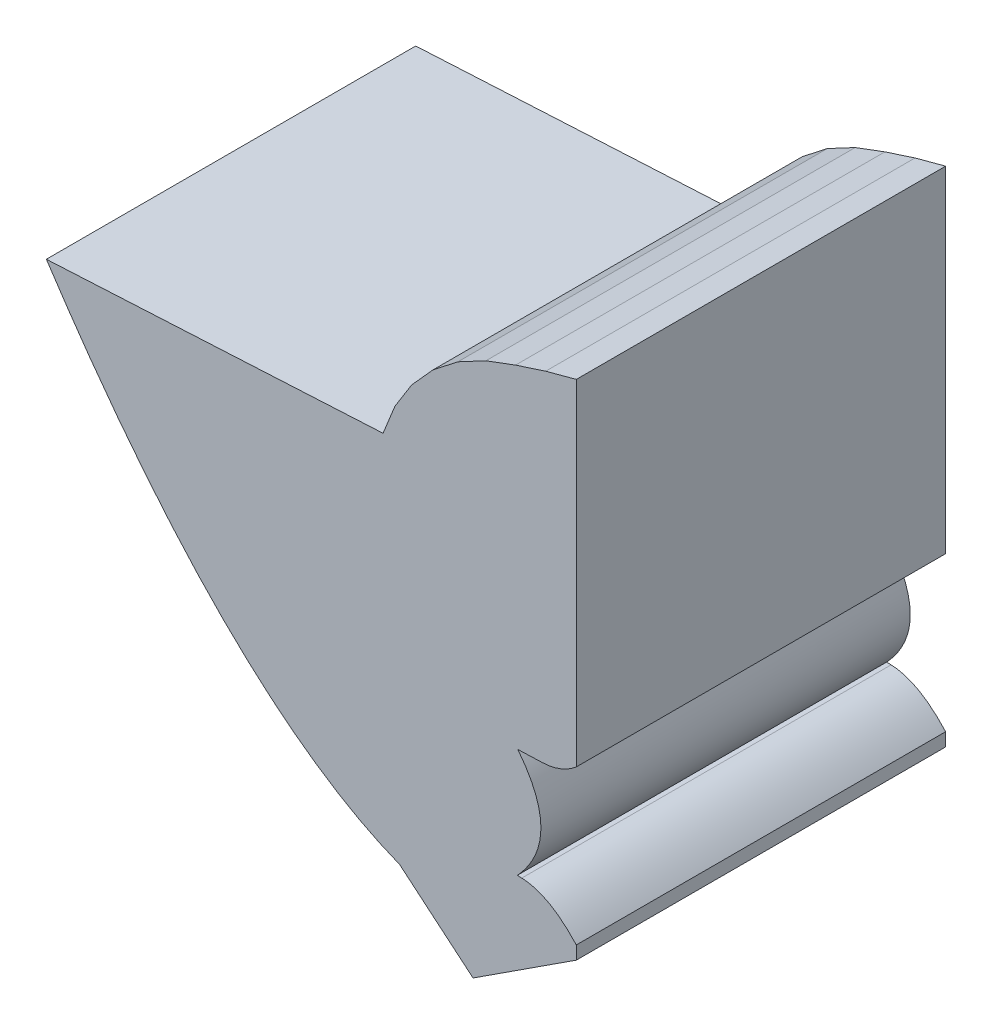
ISO-10303-21;
HEADER;
FILE_DESCRIPTION(('STEP AP214'),'2;1');
FILE_NAME('part.step','',(''),(''),'','','');
FILE_SCHEMA(('AUTOMOTIVE_DESIGN { 1 0 10303 214 1 1 1 1 }'));
ENDSEC;
DATA;
#1=APPLICATION_CONTEXT('core data for automotive mechanical design processes');
#2=APPLICATION_PROTOCOL_DEFINITION('international standard','automotive_design',2000,#1);
#3=PRODUCT_CONTEXT('',#1,'mechanical');
#4=PRODUCT('Part','Part','',(#3));
#5=PRODUCT_RELATED_PRODUCT_CATEGORY('part','',(#4));
#6=PRODUCT_DEFINITION_FORMATION('','',#4);
#7=PRODUCT_DEFINITION_CONTEXT('part definition',#1,'design');
#8=PRODUCT_DEFINITION('design','',#6,#7);
#9=PRODUCT_DEFINITION_SHAPE('','',#8);
#10=(LENGTH_UNIT() NAMED_UNIT(*) SI_UNIT(.MILLI.,.METRE.));
#11=(NAMED_UNIT(*) PLANE_ANGLE_UNIT() SI_UNIT($,.RADIAN.));
#12=(NAMED_UNIT(*) SI_UNIT($,.STERADIAN.) SOLID_ANGLE_UNIT());
#13=UNCERTAINTY_MEASURE_WITH_UNIT(LENGTH_MEASURE(1.E-05),#10,'distance_accuracy_value','');
#14=(GEOMETRIC_REPRESENTATION_CONTEXT(3) GLOBAL_UNCERTAINTY_ASSIGNED_CONTEXT((#13)) GLOBAL_UNIT_ASSIGNED_CONTEXT((#10,
#11,#12)) REPRESENTATION_CONTEXT('',''));
#15=CARTESIAN_POINT('',(0.,0.,0.));
#16=DIRECTION('',(0.,0.,1.));
#17=DIRECTION('',(1.,0.,0.));
#18=AXIS2_PLACEMENT_3D('',#15,#16,#17);
#19=CARTESIAN_POINT('',(-996004.99942647,89338.2959789018,30.7968303069805));
#20=CARTESIAN_POINT('',(996193.448091746,-87155.7427476542,30.7968303069805));
#21=CARTESIAN_POINT('',(-996386.896757022,84973.1895164066,30.7968303069805));
#22=B_SPLINE_CURVE_WITH_KNOTS('',2,(#19,#20,#21),.UNSPECIFIED.,.F.,.F.,(3,3),(0.,1.),.UNSPECIFIED.);
#23=DIRECTION('',(0.,0.,-1.));
#24=VECTOR('',#23,1.);
#25=SURFACE_OF_LINEAR_EXTRUSION('',#22,#24);
#26=CARTESIAN_POINT('',(-996004.99942647,89338.2959789018,6.9937));
#27=CARTESIAN_POINT('',(996193.448091746,-87155.7427476542,6.9937));
#28=CARTESIAN_POINT('',(-996386.896757022,84973.1895164066,6.9937));
#29=B_SPLINE_CURVE_WITH_KNOTS('',2,(#26,#27,#28),.UNSPECIFIED.,.F.,.F.,(3,3),(0.,1.),.UNSPECIFIED.);
#30=CARTESIAN_POINT('',(-2.11351559756429,2.34471545593529,6.9937));
#31=VERTEX_POINT('',#30);
#32=CARTESIAN_POINT('',(-2.13464626381644,-1.79499323034725,6.9937));
#33=VERTEX_POINT('',#32);
#34=EDGE_CURVE('E300',#31,#33,#29,.T.);
#35=ORIENTED_EDGE('',*,*,#34,.T.);
#36=DIRECTION('',(0.,0.,-1.));
#37=VECTOR('',#36,1.);
#38=CARTESIAN_POINT('',(-2.13464626331628,-1.7949932303637,0.));
#39=LINE('',#38,#37);
#40=CARTESIAN_POINT('',(-2.13464626381588,-1.79499323034727,-6.9937));
#41=VERTEX_POINT('',#40);
#42=EDGE_CURVE('E223',#33,#41,#39,.T.);
#43=ORIENTED_EDGE('',*,*,#42,.T.);
#44=CARTESIAN_POINT('',(-996004.99942647,89338.2959789018,-6.9937));
#45=CARTESIAN_POINT('',(996193.448091746,-87155.7427476542,-6.9937));
#46=CARTESIAN_POINT('',(-996386.896757022,84973.1895164066,-6.9937));
#47=B_SPLINE_CURVE_WITH_KNOTS('',2,(#44,#45,#46),.UNSPECIFIED.,.F.,.F.,(3,3),(0.,1.),.UNSPECIFIED.);
#48=CARTESIAN_POINT('',(-2.11351559802885,2.3447154697661,-6.9937));
#49=VERTEX_POINT('',#48);
#50=EDGE_CURVE('E194',#41,#49,#47,.F.);
#51=ORIENTED_EDGE('',*,*,#50,.T.);
#52=DIRECTION('',(0.,0.,-1.));
#53=VECTOR('',#52,1.);
#54=CARTESIAN_POINT('',(-2.11351560820955,2.34471546941639,0.));
#55=LINE('',#54,#53);
#56=EDGE_CURVE('E64',#49,#31,#55,.F.);
#57=ORIENTED_EDGE('',*,*,#56,.T.);
#58=EDGE_LOOP('',(#35,#43,#51,#57));
#59=FACE_BOUND('',#58,.T.);
#60=ADVANCED_FACE('F60',(#59),#25,.T.);
#61=CARTESIAN_POINT('',(-82931.2998220372,996560.090302793,30.7968303069805));
#62=CARTESIAN_POINT('',(87153.689514863,-996199.076380996,30.7968303069805));
#63=CARTESIAN_POINT('',(-91384.2921388703,995820.549302198,30.7968303069805));
#64=B_SPLINE_CURVE_WITH_KNOTS('',2,(#61,#62,#63),.UNSPECIFIED.,.F.,.F.,(3,3),(0.,1.),.UNSPECIFIED.);
#65=DIRECTION('',(0.,0.,-1.));
#66=VECTOR('',#65,1.);
#67=SURFACE_OF_LINEAR_EXTRUSION('',#64,#66);
#68=CARTESIAN_POINT('',(-82931.2998220372,996560.090302793,-6.9937));
#69=CARTESIAN_POINT('',(87153.689514863,-996199.076380996,-6.9937));
#70=CARTESIAN_POINT('',(-91384.2921388703,995820.549302198,-6.9937));
#71=B_SPLINE_CURVE_WITH_KNOTS('',2,(#68,#69,#70),.UNSPECIFIED.,.F.,.F.,(3,3),(0.,1.),.UNSPECIFIED.);
#72=CARTESIAN_POINT('',(-19.9693590135837,9.49376503209609,-6.9937));
#73=VERTEX_POINT('',#72);
#74=CARTESIAN_POINT('',(-6.59172557270748,-3.66645273975933,-6.9937));
#75=VERTEX_POINT('',#74);
#76=EDGE_CURVE('E286',#73,#75,#71,.F.);
#77=ORIENTED_EDGE('',*,*,#76,.T.);
#78=DIRECTION('',(0.,0.,-1.));
#79=VECTOR('',#78,1.);
#80=CARTESIAN_POINT('',(-6.5917255666248,-3.66645274484872,0.));
#81=LINE('',#80,#79);
#82=CARTESIAN_POINT('',(-6.59172557443743,-3.66645274183619,6.9937));
#83=VERTEX_POINT('',#82);
#84=EDGE_CURVE('E13',#75,#83,#81,.F.);
#85=ORIENTED_EDGE('',*,*,#84,.T.);
#86=CARTESIAN_POINT('',(-82931.2998220372,996560.090302793,6.9937));
#87=CARTESIAN_POINT('',(87153.689514863,-996199.076380996,6.9937));
#88=CARTESIAN_POINT('',(-91384.2921388703,995820.549302198,6.9937));
#89=B_SPLINE_CURVE_WITH_KNOTS('',2,(#86,#87,#88),.UNSPECIFIED.,.F.,.F.,(3,3),(0.,1.),.UNSPECIFIED.);
#90=CARTESIAN_POINT('',(-19.9693590135837,9.49376503209609,6.9937));
#91=VERTEX_POINT('',#90);
#92=EDGE_CURVE('E296',#83,#91,#89,.T.);
#93=ORIENTED_EDGE('',*,*,#92,.T.);
#94=DIRECTION('',(0.,0.,1.));
#95=VECTOR('',#94,1.);
#96=CARTESIAN_POINT('',(-19.9693590135837,9.49376503209609,-6.9937));
#97=LINE('',#96,#95);
#98=EDGE_CURVE('E285',#73,#91,#97,.T.);
#99=ORIENTED_EDGE('',*,*,#98,.F.);
#100=EDGE_LOOP('',(#77,#85,#93,#99));
#101=FACE_BOUND('',#100,.T.);
#102=ADVANCED_FACE('F326',(#101),#67,.T.);
#103=CARTESIAN_POINT('',(0.,0.,6.9937));
#104=DIRECTION('',(0.,0.,1.));
#105=DIRECTION('',(1.,0.,0.));
#106=AXIS2_PLACEMENT_3D('',#103,#104,#105);
#107=PLANE('',#106);
#108=ORIENTED_EDGE('',*,*,#92,.F.);
#109=DIRECTION('',(0.766044443118985,-0.642787609686532,0.));
#110=VECTOR('',#109,1.);
#111=CARTESIAN_POINT('',(-9.11243861944888,-1.55132335193491,6.9937));
#112=LINE('',#111,#110);
#113=CARTESIAN_POINT('',(-3.81071224182723,-6.,6.9937));
#114=VERTEX_POINT('',#113);
#115=EDGE_CURVE('E75',#83,#114,#112,.T.);
#116=ORIENTED_EDGE('',*,*,#115,.T.);
#117=DIRECTION('',(0.838670567945421,0.544639035015031,0.));
#118=VECTOR('',#117,1.);
#119=CARTESIAN_POINT('',(0.100000000004221,-3.46035377534417,6.9937));
#120=LINE('',#119,#118);
#121=CARTESIAN_POINT('',(0.100000000004221,-3.46035377534417,6.9937));
#122=VERTEX_POINT('',#121);
#123=EDGE_CURVE('E224',#114,#122,#120,.T.);
#124=ORIENTED_EDGE('',*,*,#123,.T.);
#125=DIRECTION('',(-3.34744710249468E-12,1.,0.));
#126=VECTOR('',#125,1.);
#127=CARTESIAN_POINT('',(0.100000000002547,-2.96035377534417,6.9937));
#128=LINE('',#127,#126);
#129=CARTESIAN_POINT('',(0.100000000002547,-2.96035377534417,6.9937));
#130=VERTEX_POINT('',#129);
#131=EDGE_CURVE('E235',#122,#130,#128,.T.);
#132=ORIENTED_EDGE('',*,*,#131,.T.);
#133=CARTESIAN_POINT('',(-15454.7110469637,-999884.399969266,6.9937));
#134=CARTESIAN_POINT('',(17450.4064372765,999845.895156391,6.9937));
#135=CARTESIAN_POINT('',(-19454.1018275892,-999814.590343517,6.9937));
#136=B_SPLINE_CURVE_WITH_KNOTS('',2,(#133,#134,#135),.UNSPECIFIED.,.F.,.F.,(3,3),(0.,1.),.UNSPECIFIED.);
#137=CARTESIAN_POINT('',(-1.96510050451409,-1.80091389872615,6.9937));
#138=VERTEX_POINT('',#137);
#139=EDGE_CURVE('E226',#130,#138,#136,.T.);
#140=ORIENTED_EDGE('',*,*,#139,.T.);
#141=DIRECTION('',(-0.999390827019096,0.0348994967025039,0.));
#142=VECTOR('',#141,1.);
#143=CARTESIAN_POINT('',(-1.96510050451409,-1.80091389872615,6.9937));
#144=LINE('',#143,#142);
#145=EDGE_CURVE('E202',#138,#33,#144,.T.);
#146=ORIENTED_EDGE('',*,*,#145,.T.);
#147=ORIENTED_EDGE('',*,*,#34,.F.);
#148=DIRECTION('',(0.999390827019096,0.0348994967025048,0.));
#149=VECTOR('',#148,1.);
#150=CARTESIAN_POINT('',(-2.17733041778456,2.34248700715526,6.9937));
#151=LINE('',#150,#149);
#152=CARTESIAN_POINT('',(-1.19050164048462,2.37694782742692,6.9937));
#153=VERTEX_POINT('',#152);
#154=EDGE_CURVE('E79',#31,#153,#151,.T.);
#155=ORIENTED_EDGE('',*,*,#154,.T.);
#156=CARTESIAN_POINT('',(-343900.072311573,939011.080499257,6.9937));
#157=CARTESIAN_POINT('',(342019.599581338,-939690.120785908,6.9937));
#158=CARTESIAN_POINT('',(-340141.301828429,940379.16107256,6.9937));
#159=B_SPLINE_CURVE_WITH_KNOTS('',2,(#156,#157,#158),.UNSPECIFIED.,.F.,.F.,(3,3),(0.,1.),.UNSPECIFIED.);
#160=CARTESIAN_POINT('',(0.100000000004221,2.87767341815847,6.9937));
#161=VERTEX_POINT('',#160);
#162=EDGE_CURVE('E279',#153,#161,#159,.T.);
#163=ORIENTED_EDGE('',*,*,#162,.T.);
#164=DIRECTION('',(0.,1.,0.));
#165=VECTOR('',#164,1.);
#166=CARTESIAN_POINT('',(0.100000000004221,2.87767341815847,6.9937));
#167=LINE('',#166,#165);
#168=CARTESIAN_POINT('',(0.100000000004747,15.587903347272,6.9937));
#169=VERTEX_POINT('',#168);
#170=EDGE_CURVE('E547',#161,#169,#167,.T.);
#171=ORIENTED_EDGE('',*,*,#170,.T.);
#172=DIRECTION('',(-0.96592582628907,-0.258819045102515,0.));
#173=VECTOR('',#172,1.);
#174=CARTESIAN_POINT('',(-1.05911099154214,15.277320493149,6.9937));
#175=LINE('',#174,#173);
#176=CARTESIAN_POINT('',(-1.05911099154214,15.277320493149,6.9937));
#177=VERTEX_POINT('',#176);
#178=EDGE_CURVE('E537',#169,#177,#175,.T.);
#179=ORIENTED_EDGE('',*,*,#178,.T.);
#180=DIRECTION('',(-0.951056516295155,-0.309016994374943,0.));
#181=VECTOR('',#180,1.);
#182=CARTESIAN_POINT('',(-2.20037881109632,14.906500099899,6.9937));
#183=LINE('',#182,#181);
#184=CARTESIAN_POINT('',(-2.20037881109632,14.906500099899,6.9937));
#185=VERTEX_POINT('',#184);
#186=EDGE_CURVE('E542',#177,#185,#183,.T.);
#187=ORIENTED_EDGE('',*,*,#186,.T.);
#188=DIRECTION('',(-0.9366721892484,-0.350207381259461,0.));
#189=VECTOR('',#188,1.);
#190=CARTESIAN_POINT('',(-3.3243854381944,14.4862512423877,6.9937));
#191=LINE('',#190,#189);
#192=CARTESIAN_POINT('',(-3.3243854381944,14.4862512423877,6.9937));
#193=VERTEX_POINT('',#192);
#194=EDGE_CURVE('E618',#185,#193,#191,.T.);
#195=ORIENTED_EDGE('',*,*,#194,.T.);
#196=DIRECTION('',(-0.882947592859007,-0.46947156278574,0.));
#197=VECTOR('',#196,1.);
#198=CARTESIAN_POINT('',(-4.38392254962521,13.9228853670448,6.9937));
#199=LINE('',#198,#197);
#200=CARTESIAN_POINT('',(-4.38392254962521,13.9228853670448,6.9937));
#201=VERTEX_POINT('',#200);
#202=EDGE_CURVE('E615',#193,#201,#199,.T.);
#203=ORIENTED_EDGE('',*,*,#202,.T.);
#204=DIRECTION('',(-0.788010753606726,-0.615661475325654,0.));
#205=VECTOR('',#204,1.);
#206=CARTESIAN_POINT('',(-5.32953545395328,13.184091596654,6.9937));
#207=LINE('',#206,#205);
#208=CARTESIAN_POINT('',(-5.32953545395328,13.184091596654,6.9937));
#209=VERTEX_POINT('',#208);
#210=EDGE_CURVE('E607',#201,#209,#207,.T.);
#211=ORIENTED_EDGE('',*,*,#210,.T.);
#212=DIRECTION('',(-0.669130606358526,-0.743144825477694,0.));
#213=VECTOR('',#212,1.);
#214=CARTESIAN_POINT('',(-6.13249218158351,12.2923178060808,6.9937));
#215=LINE('',#214,#213);
#216=CARTESIAN_POINT('',(-6.13249218158351,12.2923178060808,6.9937));
#217=VERTEX_POINT('',#216);
#218=EDGE_CURVE('E606',#209,#217,#215,.T.);
#219=ORIENTED_EDGE('',*,*,#218,.T.);
#220=DIRECTION('',(-0.52991926423321,-0.848048096156423,0.));
#221=VECTOR('',#220,1.);
#222=CARTESIAN_POINT('',(-6.76839529866336,11.2746600906931,6.9937));
#223=LINE('',#222,#221);
#224=CARTESIAN_POINT('',(-6.76839529866336,11.2746600906931,6.9937));
#225=VERTEX_POINT('',#224);
#226=EDGE_CURVE('E602',#217,#225,#223,.T.);
#227=ORIENTED_EDGE('',*,*,#226,.T.);
#228=DIRECTION('',(-0.374606593415918,-0.927183854566785,0.));
#229=VECTOR('',#228,1.);
#230=CARTESIAN_POINT('',(-7.21792321076246,10.1620394652129,6.9937));
#231=LINE('',#230,#229);
#232=CARTESIAN_POINT('',(-7.21792321076246,10.1620394652129,6.9937));
#233=VERTEX_POINT('',#232);
#234=EDGE_CURVE('E605',#225,#233,#231,.T.);
#235=ORIENTED_EDGE('',*,*,#234,.T.);
#236=DIRECTION('',(-0.998629534754487,-0.0523359562445909,0.));
#237=VECTOR('',#236,1.);
#238=CARTESIAN_POINT('',(-19.9693590135837,9.49376503209609,6.9937));
#239=LINE('',#238,#237);
#240=EDGE_CURVE('E271',#233,#91,#239,.T.);
#241=ORIENTED_EDGE('',*,*,#240,.T.);
#242=EDGE_LOOP('',(#108,#116,#124,#132,#140,#146,#147,#155,#163,#171,#179,#187,#195,#203,#211,
#219,#227,#235,#241));
#243=FACE_BOUND('',#242,.T.);
#244=ADVANCED_FACE('F329',(#243),#107,.T.);
#245=CARTESIAN_POINT('',(0.,0.,-6.9937));
#246=DIRECTION('',(0.,0.,1.));
#247=DIRECTION('',(1.,0.,0.));
#248=AXIS2_PLACEMENT_3D('',#245,#246,#247);
#249=PLANE('',#248);
#250=ORIENTED_EDGE('',*,*,#50,.F.);
#251=DIRECTION('',(0.999390827019096,-0.0348994967025039,0.));
#252=VECTOR('',#251,1.);
#253=CARTESIAN_POINT('',(-1.96510050451409,-1.80091389872615,-6.9937));
#254=LINE('',#253,#252);
#255=CARTESIAN_POINT('',(-1.96510050451409,-1.80091389872615,-6.9937));
#256=VERTEX_POINT('',#255);
#257=EDGE_CURVE('E189',#41,#256,#254,.T.);
#258=ORIENTED_EDGE('',*,*,#257,.T.);
#259=CARTESIAN_POINT('',(-15454.7110469637,-999884.399969266,-6.9937));
#260=CARTESIAN_POINT('',(17450.4064372765,999845.895156391,-6.9937));
#261=CARTESIAN_POINT('',(-19454.1018275892,-999814.590343517,-6.9937));
#262=B_SPLINE_CURVE_WITH_KNOTS('',2,(#259,#260,#261),.UNSPECIFIED.,.F.,.F.,(3,3),(0.,1.),.UNSPECIFIED.);
#263=CARTESIAN_POINT('',(0.100000000002547,-2.96035377534417,-6.9937));
#264=VERTEX_POINT('',#263);
#265=EDGE_CURVE('E195',#256,#264,#262,.F.);
#266=ORIENTED_EDGE('',*,*,#265,.T.);
#267=DIRECTION('',(3.34744710249468E-12,-1.,0.));
#268=VECTOR('',#267,1.);
#269=CARTESIAN_POINT('',(0.100000000002547,-2.96035377534417,-6.9937));
#270=LINE('',#269,#268);
#271=CARTESIAN_POINT('',(0.100000000004221,-3.46035377534417,-6.9937));
#272=VERTEX_POINT('',#271);
#273=EDGE_CURVE('E213',#264,#272,#270,.T.);
#274=ORIENTED_EDGE('',*,*,#273,.T.);
#275=DIRECTION('',(-0.838670567945421,-0.544639035015031,0.));
#276=VECTOR('',#275,1.);
#277=CARTESIAN_POINT('',(0.100000000004221,-3.46035377534417,-6.9937));
#278=LINE('',#277,#276);
#279=CARTESIAN_POINT('',(-3.81071224182723,-6.,-6.9937));
#280=VERTEX_POINT('',#279);
#281=EDGE_CURVE('E211',#272,#280,#278,.T.);
#282=ORIENTED_EDGE('',*,*,#281,.T.);
#283=DIRECTION('',(-0.766044443118985,0.642787609686532,0.));
#284=VECTOR('',#283,1.);
#285=CARTESIAN_POINT('',(-9.11243861944888,-1.55132335193491,-6.9937));
#286=LINE('',#285,#284);
#287=EDGE_CURVE('E357',#280,#75,#286,.T.);
#288=ORIENTED_EDGE('',*,*,#287,.T.);
#289=ORIENTED_EDGE('',*,*,#76,.F.);
#290=DIRECTION('',(-0.998629534754487,-0.0523359562445909,0.));
#291=VECTOR('',#290,1.);
#292=CARTESIAN_POINT('',(-19.9693590135837,9.49376503209609,-6.9937));
#293=LINE('',#292,#291);
#294=CARTESIAN_POINT('',(-7.21792321076246,10.1620394652129,-6.9937));
#295=VERTEX_POINT('',#294);
#296=EDGE_CURVE('E277',#295,#73,#293,.T.);
#297=ORIENTED_EDGE('',*,*,#296,.F.);
#298=DIRECTION('',(0.374606593415918,0.927183854566785,0.));
#299=VECTOR('',#298,1.);
#300=CARTESIAN_POINT('',(-7.21792321076246,10.1620394652129,-6.9937));
#301=LINE('',#300,#299);
#302=CARTESIAN_POINT('',(-6.76839529866336,11.2746600906931,-6.9937));
#303=VERTEX_POINT('',#302);
#304=EDGE_CURVE('E354',#295,#303,#301,.T.);
#305=ORIENTED_EDGE('',*,*,#304,.T.);
#306=DIRECTION('',(0.52991926423321,0.848048096156423,0.));
#307=VECTOR('',#306,1.);
#308=CARTESIAN_POINT('',(-6.76839529866336,11.2746600906931,-6.9937));
#309=LINE('',#308,#307);
#310=CARTESIAN_POINT('',(-6.13249218158351,12.2923178060808,-6.9937));
#311=VERTEX_POINT('',#310);
#312=EDGE_CURVE('E578',#303,#311,#309,.T.);
#313=ORIENTED_EDGE('',*,*,#312,.T.);
#314=DIRECTION('',(0.669130606358526,0.743144825477694,0.));
#315=VECTOR('',#314,1.);
#316=CARTESIAN_POINT('',(-6.13249218158351,12.2923178060808,-6.9937));
#317=LINE('',#316,#315);
#318=CARTESIAN_POINT('',(-5.32953545395328,13.184091596654,-6.9937));
#319=VERTEX_POINT('',#318);
#320=EDGE_CURVE('E635',#311,#319,#317,.T.);
#321=ORIENTED_EDGE('',*,*,#320,.T.);
#322=DIRECTION('',(0.788010753606726,0.615661475325654,0.));
#323=VECTOR('',#322,1.);
#324=CARTESIAN_POINT('',(-5.32953545395328,13.184091596654,-6.9937));
#325=LINE('',#324,#323);
#326=CARTESIAN_POINT('',(-4.38392254962521,13.9228853670448,-6.9937));
#327=VERTEX_POINT('',#326);
#328=EDGE_CURVE('E628',#319,#327,#325,.T.);
#329=ORIENTED_EDGE('',*,*,#328,.T.);
#330=DIRECTION('',(0.882947592859007,0.46947156278574,0.));
#331=VECTOR('',#330,1.);
#332=CARTESIAN_POINT('',(-4.38392254962521,13.9228853670448,-6.9937));
#333=LINE('',#332,#331);
#334=CARTESIAN_POINT('',(-3.3243854381944,14.4862512423877,-6.9937));
#335=VERTEX_POINT('',#334);
#336=EDGE_CURVE('E630',#327,#335,#333,.T.);
#337=ORIENTED_EDGE('',*,*,#336,.T.);
#338=DIRECTION('',(0.9366721892484,0.350207381259461,0.));
#339=VECTOR('',#338,1.);
#340=CARTESIAN_POINT('',(-3.3243854381944,14.4862512423877,-6.9937));
#341=LINE('',#340,#339);
#342=CARTESIAN_POINT('',(-2.20037881109632,14.906500099899,-6.9937));
#343=VERTEX_POINT('',#342);
#344=EDGE_CURVE('E621',#335,#343,#341,.T.);
#345=ORIENTED_EDGE('',*,*,#344,.T.);
#346=DIRECTION('',(0.951056516295155,0.309016994374943,0.));
#347=VECTOR('',#346,1.);
#348=CARTESIAN_POINT('',(-2.20037881109632,14.906500099899,-6.9937));
#349=LINE('',#348,#347);
#350=CARTESIAN_POINT('',(-1.05911099154214,15.277320493149,-6.9937));
#351=VERTEX_POINT('',#350);
#352=EDGE_CURVE('E595',#343,#351,#349,.T.);
#353=ORIENTED_EDGE('',*,*,#352,.T.);
#354=DIRECTION('',(0.96592582628907,0.258819045102515,0.));
#355=VECTOR('',#354,1.);
#356=CARTESIAN_POINT('',(-1.05911099154214,15.277320493149,-6.9937));
#357=LINE('',#356,#355);
#358=CARTESIAN_POINT('',(0.100000000004747,15.587903347272,-6.9937));
#359=VERTEX_POINT('',#358);
#360=EDGE_CURVE('E589',#351,#359,#357,.T.);
#361=ORIENTED_EDGE('',*,*,#360,.T.);
#362=DIRECTION('',(0.,-1.,0.));
#363=VECTOR('',#362,1.);
#364=CARTESIAN_POINT('',(0.100000000004221,2.87767341815847,-6.9937));
#365=LINE('',#364,#363);
#366=CARTESIAN_POINT('',(0.0999999999995449,2.8776734181557,-6.9937));
#367=VERTEX_POINT('',#366);
#368=EDGE_CURVE('E580',#359,#367,#365,.T.);
#369=ORIENTED_EDGE('',*,*,#368,.T.);
#370=CARTESIAN_POINT('',(-343900.072311573,939011.080499257,-6.9937));
#371=CARTESIAN_POINT('',(342019.599581338,-939690.120785908,-6.9937));
#372=CARTESIAN_POINT('',(-340141.301828429,940379.16107256,-6.9937));
#373=B_SPLINE_CURVE_WITH_KNOTS('',2,(#370,#371,#372),.UNSPECIFIED.,.F.,.F.,(3,3),(0.,1.),.UNSPECIFIED.);
#374=CARTESIAN_POINT('',(-1.19050164048462,2.37694782741517,-6.9937));
#375=VERTEX_POINT('',#374);
#376=EDGE_CURVE('E575',#367,#375,#373,.F.);
#377=ORIENTED_EDGE('',*,*,#376,.T.);
#378=DIRECTION('',(-0.999390827019096,-0.0348994967025048,0.));
#379=VECTOR('',#378,1.);
#380=CARTESIAN_POINT('',(-2.17733041778456,2.34248700715526,-6.9937));
#381=LINE('',#380,#379);
#382=EDGE_CURVE('E574',#375,#49,#381,.T.);
#383=ORIENTED_EDGE('',*,*,#382,.T.);
#384=EDGE_LOOP('',(#250,#258,#266,#274,#282,#288,#289,#297,#305,#313,#321,#329,#337,#345,#353,
#361,#369,#377,#383));
#385=FACE_BOUND('',#384,.T.);
#386=ADVANCED_FACE('F56',(#385),#249,.F.);
#387=CARTESIAN_POINT('',(-19.9693590135837,9.49376503209609,-6.9937));
#388=DIRECTION('',(-0.0523359562445909,0.998629534754487,0.));
#389=DIRECTION('',(-0.998629534754488,-0.052335956244591,0.));
#390=AXIS2_PLACEMENT_3D('',#387,#388,#389);
#391=PLANE('',#390);
#392=ORIENTED_EDGE('',*,*,#240,.F.);
#393=DIRECTION('',(0.,0.,-1.));
#394=VECTOR('',#393,1.);
#395=CARTESIAN_POINT('',(-7.21792321076246,10.1620394652129,23.8402253000013));
#396=LINE('',#395,#394);
#397=EDGE_CURVE('E350',#233,#295,#396,.T.);
#398=ORIENTED_EDGE('',*,*,#397,.T.);
#399=ORIENTED_EDGE('',*,*,#296,.T.);
#400=ORIENTED_EDGE('',*,*,#98,.T.);
#401=EDGE_LOOP('',(#392,#398,#399,#400));
#402=FACE_BOUND('',#401,.T.);
#403=ADVANCED_FACE('F335',(#402),#391,.T.);
#404=CARTESIAN_POINT('',(-1.05911099154214,15.277320493149,23.8402253000013));
#405=DIRECTION('',(0.258819045102515,-0.96592582628907,0.));
#406=DIRECTION('',(0.96592582628907,0.258819045102515,0.));
#407=AXIS2_PLACEMENT_3D('',#404,#405,#406);
#408=PLANE('',#407);
#409=ORIENTED_EDGE('',*,*,#178,.F.);
#410=DIRECTION('',(0.,0.,-1.));
#411=VECTOR('',#410,1.);
#412=CARTESIAN_POINT('',(0.100000000004747,15.587903347272,23.8402253000013));
#413=LINE('',#412,#411);
#414=EDGE_CURVE('E272',#169,#359,#413,.T.);
#415=ORIENTED_EDGE('',*,*,#414,.T.);
#416=ORIENTED_EDGE('',*,*,#360,.F.);
#417=DIRECTION('',(0.,0.,-1.));
#418=VECTOR('',#417,1.);
#419=CARTESIAN_POINT('',(-1.05911099154214,15.277320493149,23.8402253000013));
#420=LINE('',#419,#418);
#421=EDGE_CURVE('E545',#177,#351,#420,.T.);
#422=ORIENTED_EDGE('',*,*,#421,.F.);
#423=EDGE_LOOP('',(#409,#415,#416,#422));
#424=FACE_BOUND('',#423,.T.);
#425=ADVANCED_FACE('F495',(#424),#408,.F.);
#426=CARTESIAN_POINT('',(-2.20037881109632,14.906500099899,23.8402253000013));
#427=DIRECTION('',(0.309016994374943,-0.951056516295155,0.));
#428=DIRECTION('',(0.951056516295155,0.309016994374943,0.));
#429=AXIS2_PLACEMENT_3D('',#426,#427,#428);
#430=PLANE('',#429);
#431=ORIENTED_EDGE('',*,*,#186,.F.);
#432=ORIENTED_EDGE('',*,*,#421,.T.);
#433=ORIENTED_EDGE('',*,*,#352,.F.);
#434=DIRECTION('',(0.,0.,-1.));
#435=VECTOR('',#434,1.);
#436=CARTESIAN_POINT('',(-2.20037881109632,14.906500099899,23.8402253000013));
#437=LINE('',#436,#435);
#438=EDGE_CURVE('E560',#185,#343,#437,.T.);
#439=ORIENTED_EDGE('',*,*,#438,.F.);
#440=EDGE_LOOP('',(#431,#432,#433,#439));
#441=FACE_BOUND('',#440,.T.);
#442=ADVANCED_FACE('F485',(#441),#430,.F.);
#443=CARTESIAN_POINT('',(-3.3243854381944,14.4862512423877,23.8402253000013));
#444=DIRECTION('',(0.350207381259461,-0.9366721892484,0.));
#445=DIRECTION('',(0.9366721892484,0.350207381259461,0.));
#446=AXIS2_PLACEMENT_3D('',#443,#444,#445);
#447=PLANE('',#446);
#448=ORIENTED_EDGE('',*,*,#194,.F.);
#449=ORIENTED_EDGE('',*,*,#438,.T.);
#450=ORIENTED_EDGE('',*,*,#344,.F.);
#451=DIRECTION('',(0.,0.,-1.));
#452=VECTOR('',#451,1.);
#453=CARTESIAN_POINT('',(-3.3243854381944,14.4862512423877,23.8402253000013));
#454=LINE('',#453,#452);
#455=EDGE_CURVE('E559',#193,#335,#454,.T.);
#456=ORIENTED_EDGE('',*,*,#455,.F.);
#457=EDGE_LOOP('',(#448,#449,#450,#456));
#458=FACE_BOUND('',#457,.T.);
#459=ADVANCED_FACE('F472',(#458),#447,.F.);
#460=CARTESIAN_POINT('',(-4.38392254962521,13.9228853670448,23.8402253000013));
#461=DIRECTION('',(0.46947156278574,-0.882947592859007,0.));
#462=DIRECTION('',(0.882947592859007,0.46947156278574,0.));
#463=AXIS2_PLACEMENT_3D('',#460,#461,#462);
#464=PLANE('',#463);
#465=ORIENTED_EDGE('',*,*,#202,.F.);
#466=ORIENTED_EDGE('',*,*,#455,.T.);
#467=ORIENTED_EDGE('',*,*,#336,.F.);
#468=DIRECTION('',(0.,0.,-1.));
#469=VECTOR('',#468,1.);
#470=CARTESIAN_POINT('',(-4.38392254962521,13.9228853670448,23.8402253000013));
#471=LINE('',#470,#469);
#472=EDGE_CURVE('E561',#201,#327,#471,.T.);
#473=ORIENTED_EDGE('',*,*,#472,.F.);
#474=EDGE_LOOP('',(#465,#466,#467,#473));
#475=FACE_BOUND('',#474,.T.);
#476=ADVANCED_FACE('F464',(#475),#464,.F.);
#477=CARTESIAN_POINT('',(-5.32953545395328,13.184091596654,23.8402253000013));
#478=DIRECTION('',(0.615661475325654,-0.788010753606726,0.));
#479=DIRECTION('',(0.788010753606726,0.615661475325654,0.));
#480=AXIS2_PLACEMENT_3D('',#477,#478,#479);
#481=PLANE('',#480);
#482=ORIENTED_EDGE('',*,*,#210,.F.);
#483=ORIENTED_EDGE('',*,*,#472,.T.);
#484=ORIENTED_EDGE('',*,*,#328,.F.);
#485=DIRECTION('',(0.,0.,-1.));
#486=VECTOR('',#485,1.);
#487=CARTESIAN_POINT('',(-5.32953545395328,13.184091596654,23.8402253000013));
#488=LINE('',#487,#486);
#489=EDGE_CURVE('E563',#209,#319,#488,.T.);
#490=ORIENTED_EDGE('',*,*,#489,.F.);
#491=EDGE_LOOP('',(#482,#483,#484,#490));
#492=FACE_BOUND('',#491,.T.);
#493=ADVANCED_FACE('F456',(#492),#481,.F.);
#494=CARTESIAN_POINT('',(-6.13249218158351,12.2923178060808,23.8402253000013));
#495=DIRECTION('',(0.743144825477694,-0.669130606358526,0.));
#496=DIRECTION('',(0.669130606358526,0.743144825477694,0.));
#497=AXIS2_PLACEMENT_3D('',#494,#495,#496);
#498=PLANE('',#497);
#499=ORIENTED_EDGE('',*,*,#218,.F.);
#500=ORIENTED_EDGE('',*,*,#489,.T.);
#501=ORIENTED_EDGE('',*,*,#320,.F.);
#502=DIRECTION('',(0.,0.,-1.));
#503=VECTOR('',#502,1.);
#504=CARTESIAN_POINT('',(-6.13249218158351,12.2923178060808,23.8402253000013));
#505=LINE('',#504,#503);
#506=EDGE_CURVE('E564',#217,#311,#505,.T.);
#507=ORIENTED_EDGE('',*,*,#506,.F.);
#508=EDGE_LOOP('',(#499,#500,#501,#507));
#509=FACE_BOUND('',#508,.T.);
#510=ADVANCED_FACE('F450',(#509),#498,.F.);
#511=CARTESIAN_POINT('',(-6.76839529866336,11.2746600906931,23.8402253000013));
#512=DIRECTION('',(0.848048096156423,-0.529919264233209,0.));
#513=DIRECTION('',(0.52991926423321,0.848048096156423,0.));
#514=AXIS2_PLACEMENT_3D('',#511,#512,#513);
#515=PLANE('',#514);
#516=ORIENTED_EDGE('',*,*,#226,.F.);
#517=ORIENTED_EDGE('',*,*,#506,.T.);
#518=ORIENTED_EDGE('',*,*,#312,.F.);
#519=DIRECTION('',(0.,0.,-1.));
#520=VECTOR('',#519,1.);
#521=CARTESIAN_POINT('',(-6.76839529866336,11.2746600906931,23.8402253000013));
#522=LINE('',#521,#520);
#523=EDGE_CURVE('E570',#225,#303,#522,.T.);
#524=ORIENTED_EDGE('',*,*,#523,.F.);
#525=EDGE_LOOP('',(#516,#517,#518,#524));
#526=FACE_BOUND('',#525,.T.);
#527=ADVANCED_FACE('F437',(#526),#515,.F.);
#528=CARTESIAN_POINT('',(-7.21792321076246,10.1620394652129,23.8402253000013));
#529=DIRECTION('',(0.927183854566785,-0.374606593415918,0.));
#530=DIRECTION('',(0.374606593415918,0.927183854566785,0.));
#531=AXIS2_PLACEMENT_3D('',#528,#529,#530);
#532=PLANE('',#531);
#533=ORIENTED_EDGE('',*,*,#234,.F.);
#534=ORIENTED_EDGE('',*,*,#523,.T.);
#535=ORIENTED_EDGE('',*,*,#304,.F.);
#536=ORIENTED_EDGE('',*,*,#397,.F.);
#537=EDGE_LOOP('',(#533,#534,#535,#536));
#538=FACE_BOUND('',#537,.T.);
#539=ADVANCED_FACE('F435',(#538),#532,.F.);
#540=CARTESIAN_POINT('',(-2.17733041778456,2.34248700715526,23.8402253000013));
#541=DIRECTION('',(-0.0348994967025048,0.999390827019096,0.));
#542=DIRECTION('',(-0.999390827019096,-0.0348994967025048,0.));
#543=AXIS2_PLACEMENT_3D('',#540,#541,#542);
#544=PLANE('',#543);
#545=ORIENTED_EDGE('',*,*,#56,.F.);
#546=ORIENTED_EDGE('',*,*,#382,.F.);
#547=DIRECTION('',(0.,0.,-1.));
#548=VECTOR('',#547,1.);
#549=CARTESIAN_POINT('',(-1.19050164048462,2.37694782742692,23.8402253000013));
#550=LINE('',#549,#548);
#551=EDGE_CURVE('E551',#153,#375,#550,.T.);
#552=ORIENTED_EDGE('',*,*,#551,.F.);
#553=ORIENTED_EDGE('',*,*,#154,.F.);
#554=EDGE_LOOP('',(#545,#546,#552,#553));
#555=FACE_BOUND('',#554,.T.);
#556=ADVANCED_FACE('F262',(#555),#544,.F.);
#557=CARTESIAN_POINT('',(-343900.072311573,939011.080499257,23.8402253000013));
#558=CARTESIAN_POINT('',(342019.599581338,-939690.120785908,23.8402253000013));
#559=CARTESIAN_POINT('',(-340141.301828429,940379.16107256,23.8402253000013));
#560=B_SPLINE_CURVE_WITH_KNOTS('',2,(#557,#558,#559),.UNSPECIFIED.,.F.,.F.,(3,3),(0.,1.),.UNSPECIFIED.);
#561=DIRECTION('',(0.,0.,-1.));
#562=VECTOR('',#561,1.);
#563=SURFACE_OF_LINEAR_EXTRUSION('',#560,#562);
#564=ORIENTED_EDGE('',*,*,#162,.F.);
#565=ORIENTED_EDGE('',*,*,#551,.T.);
#566=ORIENTED_EDGE('',*,*,#376,.F.);
#567=DIRECTION('',(0.,0.,-1.));
#568=VECTOR('',#567,1.);
#569=CARTESIAN_POINT('',(0.100000000004221,2.87767341815847,23.8402253000013));
#570=LINE('',#569,#568);
#571=EDGE_CURVE('E553',#161,#367,#570,.T.);
#572=ORIENTED_EDGE('',*,*,#571,.F.);
#573=EDGE_LOOP('',(#564,#565,#566,#572));
#574=FACE_BOUND('',#573,.T.);
#575=ADVANCED_FACE('F256',(#574),#563,.F.);
#576=CARTESIAN_POINT('',(0.100000000004221,2.87767341815847,23.8402253000013));
#577=DIRECTION('',(-1.,0.,0.));
#578=DIRECTION('',(0.,-1.,0.));
#579=AXIS2_PLACEMENT_3D('',#576,#577,#578);
#580=PLANE('',#579);
#581=ORIENTED_EDGE('',*,*,#170,.F.);
#582=ORIENTED_EDGE('',*,*,#571,.T.);
#583=ORIENTED_EDGE('',*,*,#368,.F.);
#584=ORIENTED_EDGE('',*,*,#414,.F.);
#585=EDGE_LOOP('',(#581,#582,#583,#584));
#586=FACE_BOUND('',#585,.T.);
#587=ADVANCED_FACE('F251',(#586),#580,.F.);
#588=CARTESIAN_POINT('',(-15454.7110469637,-999884.399969266,17.2240347568099));
#589=CARTESIAN_POINT('',(17450.4064372765,999845.895156391,17.2240347568099));
#590=CARTESIAN_POINT('',(-19454.1018275892,-999814.590343517,17.2240347568099));
#591=B_SPLINE_CURVE_WITH_KNOTS('',2,(#588,#589,#590),.UNSPECIFIED.,.F.,.F.,(3,3),(0.,1.),.UNSPECIFIED.);
#592=DIRECTION('',(0.,0.,-1.));
#593=VECTOR('',#592,1.);
#594=SURFACE_OF_LINEAR_EXTRUSION('',#591,#593);
#595=ORIENTED_EDGE('',*,*,#139,.F.);
#596=DIRECTION('',(0.,0.,-1.));
#597=VECTOR('',#596,1.);
#598=CARTESIAN_POINT('',(0.100000000002547,-2.96035377534417,17.2240347568099));
#599=LINE('',#598,#597);
#600=EDGE_CURVE('E197',#130,#264,#599,.T.);
#601=ORIENTED_EDGE('',*,*,#600,.T.);
#602=ORIENTED_EDGE('',*,*,#265,.F.);
#603=DIRECTION('',(0.,0.,-1.));
#604=VECTOR('',#603,1.);
#605=CARTESIAN_POINT('',(-1.96510050451409,-1.80091389872615,17.2240347568099));
#606=LINE('',#605,#604);
#607=EDGE_CURVE('E201',#138,#256,#606,.T.);
#608=ORIENTED_EDGE('',*,*,#607,.F.);
#609=EDGE_LOOP('',(#595,#601,#602,#608));
#610=FACE_BOUND('',#609,.T.);
#611=ADVANCED_FACE('F208',(#610),#594,.F.);
#612=CARTESIAN_POINT('',(-1.96510050451409,-1.80091389872615,17.2240347568099));
#613=DIRECTION('',(-0.0348994967025039,-0.999390827019096,0.));
#614=DIRECTION('',(0.999390827019096,-0.0348994967025039,0.));
#615=AXIS2_PLACEMENT_3D('',#612,#613,#614);
#616=PLANE('',#615);
#617=ORIENTED_EDGE('',*,*,#42,.F.);
#618=ORIENTED_EDGE('',*,*,#145,.F.);
#619=ORIENTED_EDGE('',*,*,#607,.T.);
#620=ORIENTED_EDGE('',*,*,#257,.F.);
#621=EDGE_LOOP('',(#617,#618,#619,#620));
#622=FACE_BOUND('',#621,.T.);
#623=ADVANCED_FACE('F205',(#622),#616,.F.);
#624=CARTESIAN_POINT('',(-9.11243861944888,-1.55132335193491,17.2240347568099));
#625=DIRECTION('',(0.642787609686532,0.766044443118984,0.));
#626=DIRECTION('',(-0.766044443118985,0.642787609686532,0.));
#627=AXIS2_PLACEMENT_3D('',#624,#625,#626);
#628=PLANE('',#627);
#629=ORIENTED_EDGE('',*,*,#84,.F.);
#630=ORIENTED_EDGE('',*,*,#287,.F.);
#631=DIRECTION('',(0.,0.,-1.));
#632=VECTOR('',#631,1.);
#633=CARTESIAN_POINT('',(-3.81071224182723,-6.,17.2240347568099));
#634=LINE('',#633,#632);
#635=EDGE_CURVE('E206',#114,#280,#634,.T.);
#636=ORIENTED_EDGE('',*,*,#635,.F.);
#637=ORIENTED_EDGE('',*,*,#115,.F.);
#638=EDGE_LOOP('',(#629,#630,#636,#637));
#639=FACE_BOUND('',#638,.T.);
#640=ADVANCED_FACE('F359',(#639),#628,.F.);
#641=CARTESIAN_POINT('',(0.100000000004221,-3.46035377534417,17.2240347568099));
#642=DIRECTION('',(-0.544639035015031,0.838670567945421,0.));
#643=DIRECTION('',(-0.838670567945421,-0.544639035015031,0.));
#644=AXIS2_PLACEMENT_3D('',#641,#642,#643);
#645=PLANE('',#644);
#646=ORIENTED_EDGE('',*,*,#123,.F.);
#647=ORIENTED_EDGE('',*,*,#635,.T.);
#648=ORIENTED_EDGE('',*,*,#281,.F.);
#649=DIRECTION('',(0.,0.,-1.));
#650=VECTOR('',#649,1.);
#651=CARTESIAN_POINT('',(0.100000000004221,-3.46035377534417,17.2240347568099));
#652=LINE('',#651,#650);
#653=EDGE_CURVE('E240',#122,#272,#652,.T.);
#654=ORIENTED_EDGE('',*,*,#653,.F.);
#655=EDGE_LOOP('',(#646,#647,#648,#654));
#656=FACE_BOUND('',#655,.T.);
#657=ADVANCED_FACE('F365',(#656),#645,.F.);
#658=CARTESIAN_POINT('',(0.100000000002547,-2.96035377534417,17.2240347568099));
#659=DIRECTION('',(-1.,-3.34744710249468E-12,0.));
#660=DIRECTION('',(3.34744710249468E-12,-1.,0.));
#661=AXIS2_PLACEMENT_3D('',#658,#659,#660);
#662=PLANE('',#661);
#663=ORIENTED_EDGE('',*,*,#131,.F.);
#664=ORIENTED_EDGE('',*,*,#653,.T.);
#665=ORIENTED_EDGE('',*,*,#273,.F.);
#666=ORIENTED_EDGE('',*,*,#600,.F.);
#667=EDGE_LOOP('',(#663,#664,#665,#666));
#668=FACE_BOUND('',#667,.T.);
#669=ADVANCED_FACE('F362',(#668),#662,.F.);
#670=CLOSED_SHELL('',(#60,#102,#244,#386,#403,#425,#442,#459,#476,#493,#510,#527,#539,#556,#575,
#587,#611,#623,#640,#657,#669));
#671=MANIFOLD_SOLID_BREP('B2',#670);
#672=ADVANCED_BREP_SHAPE_REPRESENTATION('',(#18,#671),#14);
#673=SHAPE_DEFINITION_REPRESENTATION(#9,#672);
ENDSEC;
END-ISO-10303-21;
